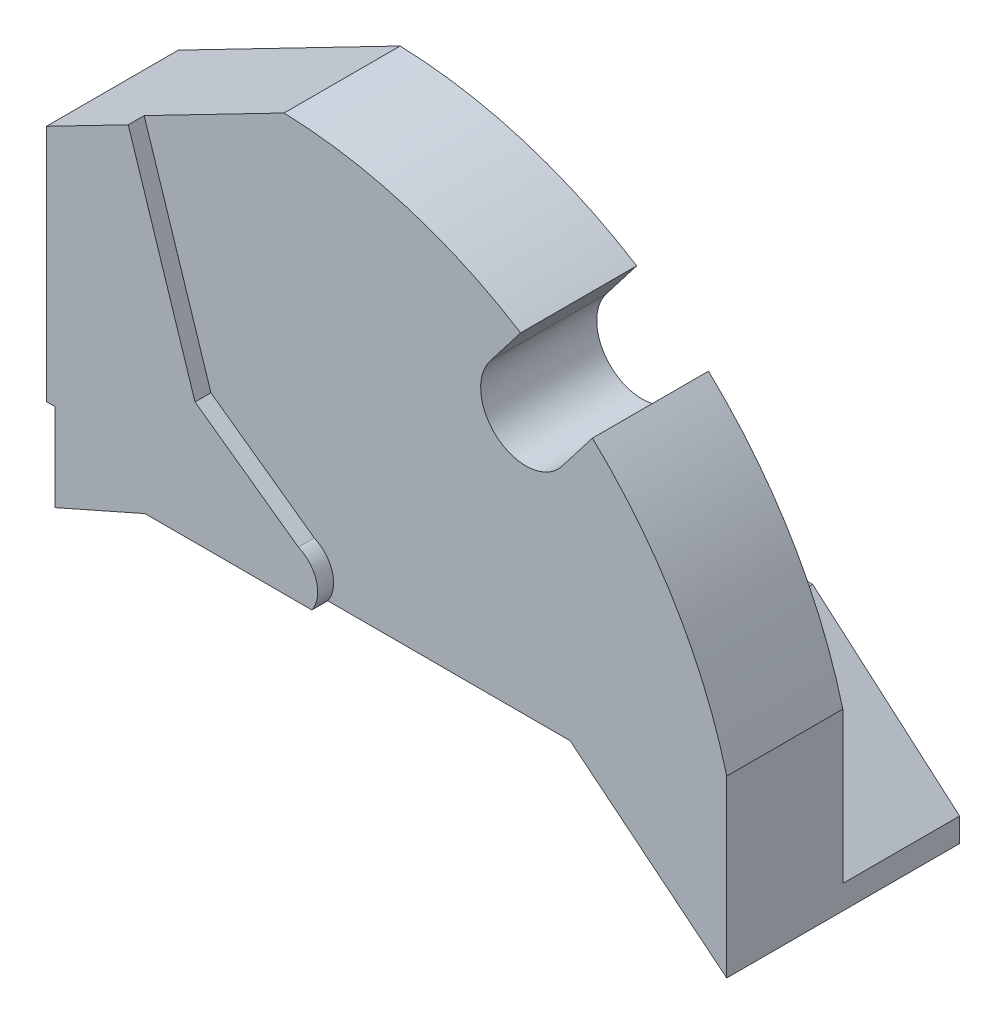
ISO-10303-21;
HEADER;
FILE_DESCRIPTION(('STEP AP214'),'2;1');
FILE_NAME('part.step','',(''),(''),'','','');
FILE_SCHEMA(('AUTOMOTIVE_DESIGN { 1 0 10303 214 1 1 1 1 }'));
ENDSEC;
DATA;
#1=APPLICATION_CONTEXT('core data for automotive mechanical design processes');
#2=APPLICATION_PROTOCOL_DEFINITION('international standard','automotive_design',2000,#1);
#3=PRODUCT_CONTEXT('',#1,'mechanical');
#4=PRODUCT('Part','Part','',(#3));
#5=PRODUCT_RELATED_PRODUCT_CATEGORY('part','',(#4));
#6=PRODUCT_DEFINITION_FORMATION('','',#4);
#7=PRODUCT_DEFINITION_CONTEXT('part definition',#1,'design');
#8=PRODUCT_DEFINITION('design','',#6,#7);
#9=PRODUCT_DEFINITION_SHAPE('','',#8);
#10=(LENGTH_UNIT() NAMED_UNIT(*) SI_UNIT(.MILLI.,.METRE.));
#11=(NAMED_UNIT(*) PLANE_ANGLE_UNIT() SI_UNIT($,.RADIAN.));
#12=(NAMED_UNIT(*) SI_UNIT($,.STERADIAN.) SOLID_ANGLE_UNIT());
#13=UNCERTAINTY_MEASURE_WITH_UNIT(LENGTH_MEASURE(1.E-05),#10,'distance_accuracy_value','');
#14=(GEOMETRIC_REPRESENTATION_CONTEXT(3) GLOBAL_UNCERTAINTY_ASSIGNED_CONTEXT((#13)) GLOBAL_UNIT_ASSIGNED_CONTEXT((#10,
#11,#12)) REPRESENTATION_CONTEXT('',''));
#15=CARTESIAN_POINT('',(0.,0.,0.));
#16=DIRECTION('',(0.,0.,1.));
#17=DIRECTION('',(1.,0.,0.));
#18=AXIS2_PLACEMENT_3D('',#15,#16,#17);
#19=CARTESIAN_POINT('',(0.,0.,0.));
#20=DIRECTION('',(0.,0.,1.));
#21=DIRECTION('',(1.,0.,0.));
#22=AXIS2_PLACEMENT_3D('',#19,#20,#21);
#23=PLANE('',#22);
#24=DIRECTION('',(0.756363172452144,-0.654151932931584,0.));
#25=VECTOR('',#24,1.);
#26=CARTESIAN_POINT('',(65.1,-3.00000000000001,0.));
#27=LINE('',#26,#25);
#28=CARTESIAN_POINT('',(65.1,-3.00000000000001,0.));
#29=VERTEX_POINT('',#28);
#30=CARTESIAN_POINT('',(83.6,-19.,0.));
#31=VERTEX_POINT('',#30);
#32=EDGE_CURVE('E469',#29,#31,#27,.T.);
#33=ORIENTED_EDGE('',*,*,#32,.F.);
#34=DIRECTION('',(1.,0.,0.));
#35=VECTOR('',#34,1.);
#36=CARTESIAN_POINT('',(1.1,-3.,0.));
#37=LINE('',#36,#35);
#38=CARTESIAN_POINT('',(1.1,-3.,0.));
#39=VERTEX_POINT('',#38);
#40=EDGE_CURVE('E538',#39,#29,#37,.T.);
#41=ORIENTED_EDGE('',*,*,#40,.F.);
#42=DIRECTION('',(0.,-1.,0.));
#43=VECTOR('',#42,1.);
#44=CARTESIAN_POINT('',(1.1,0.,0.));
#45=LINE('',#44,#43);
#46=CARTESIAN_POINT('',(1.1,0.,0.));
#47=VERTEX_POINT('',#46);
#48=EDGE_CURVE('E434',#47,#39,#45,.T.);
#49=ORIENTED_EDGE('',*,*,#48,.F.);
#50=DIRECTION('',(1.,0.,0.));
#51=VECTOR('',#50,1.);
#52=CARTESIAN_POINT('',(0.,0.,0.));
#53=LINE('',#52,#51);
#54=CARTESIAN_POINT('',(0.,0.,0.));
#55=VERTEX_POINT('',#54);
#56=EDGE_CURVE('E441',#55,#47,#53,.T.);
#57=ORIENTED_EDGE('',*,*,#56,.F.);
#58=DIRECTION('',(0.,1.,0.));
#59=VECTOR('',#58,1.);
#60=CARTESIAN_POINT('',(0.,0.,0.));
#61=LINE('',#60,#59);
#62=CARTESIAN_POINT('',(0.,30.,0.));
#63=VERTEX_POINT('',#62);
#64=EDGE_CURVE('E216',#55,#63,#61,.T.);
#65=ORIENTED_EDGE('',*,*,#64,.T.);
#66=DIRECTION('',(0.888620657054864,0.458642919770252,0.));
#67=VECTOR('',#66,1.);
#68=CARTESIAN_POINT('',(-12.2267871815941,23.6894001643385,0.));
#69=LINE('',#68,#67);
#70=CARTESIAN_POINT('',(27.9026886315227,44.4013876807859,0.));
#71=VERTEX_POINT('',#70);
#72=EDGE_CURVE('E415',#63,#71,#69,.T.);
#73=ORIENTED_EDGE('',*,*,#72,.T.);
#74=CARTESIAN_POINT('',(26.0383155725036,-15.0714703881564,0.));
#75=DIRECTION('',(0.,0.,1.));
#76=DIRECTION('',(1.,0.,0.));
#77=AXIS2_PLACEMENT_3D('',#74,#75,#76);
#78=CIRCLE('',#77,59.5020733570836);
#79=CARTESIAN_POINT('',(57.6691300930447,35.3268262751127,0.));
#80=VERTEX_POINT('',#79);
#81=EDGE_CURVE('E409',#71,#80,#78,.F.);
#82=ORIENTED_EDGE('',*,*,#81,.T.);
#83=DIRECTION('',(-0.610285473289121,-0.792181570785558,0.));
#84=VECTOR('',#83,1.);
#85=CARTESIAN_POINT('',(19.1113591408394,-14.7231206690401,0.));
#86=LINE('',#85,#84);
#87=CARTESIAN_POINT('',(53.8243316113232,30.3360823791637,0.));
#88=VERTEX_POINT('',#87);
#89=EDGE_CURVE('E401',#80,#88,#86,.T.);
#90=ORIENTED_EDGE('',*,*,#89,.T.);
#91=CARTESIAN_POINT('',(58.3397665648009,26.8574551814157,0.));
#92=DIRECTION('',(0.,0.,1.));
#93=DIRECTION('',(1.,0.,0.));
#94=AXIS2_PLACEMENT_3D('',#91,#92,#93);
#95=CIRCLE('',#94,5.69999999999999);
#96=CARTESIAN_POINT('',(62.8552015182785,23.3788279836677,0.));
#97=VERTEX_POINT('',#96);
#98=EDGE_CURVE('E410',#88,#97,#95,.T.);
#99=ORIENTED_EDGE('',*,*,#98,.T.);
#100=DIRECTION('',(-0.610285473289121,-0.792181570785558,0.));
#101=VECTOR('',#100,1.);
#102=CARTESIAN_POINT('',(28.1422290477947,-21.6803750645361,0.));
#103=LINE('',#102,#101);
#104=CARTESIAN_POINT('',(66.7,28.3695718796167,0.));
#105=VERTEX_POINT('',#104);
#106=EDGE_CURVE('E424',#105,#97,#103,.T.);
#107=ORIENTED_EDGE('',*,*,#106,.F.);
#108=CARTESIAN_POINT('',(83.6,0.,0.));
#109=VERTEX_POINT('',#108);
#110=EDGE_CURVE('E419',#105,#109,#78,.F.);
#111=ORIENTED_EDGE('',*,*,#110,.T.);
#112=DIRECTION('',(0.,1.,0.));
#113=VECTOR('',#112,1.);
#114=CARTESIAN_POINT('',(83.6,0.,0.));
#115=LINE('',#114,#113);
#116=EDGE_CURVE('E425',#31,#109,#115,.T.);
#117=ORIENTED_EDGE('',*,*,#116,.F.);
#118=EDGE_LOOP('',(#33,#41,#49,#57,#65,#73,#82,#90,#99,#107,#111,#117));
#119=FACE_BOUND('',#118,.T.);
#120=ADVANCED_FACE('F47',(#119),#23,.F.);
#121=CARTESIAN_POINT('',(0.,-6.,14.6));
#122=DIRECTION('',(0.,1.,0.));
#123=DIRECTION('',(0.,0.,1.));
#124=AXIS2_PLACEMENT_3D('',#121,#122,#123);
#125=PLANE('',#124);
#126=DIRECTION('',(-1.,0.,0.));
#127=VECTOR('',#126,1.);
#128=CARTESIAN_POINT('',(1.1,-6.,-11.6));
#129=LINE('',#128,#127);
#130=CARTESIAN_POINT('',(62.8102178134441,-6.,-11.6));
#131=VERTEX_POINT('',#130);
#132=CARTESIAN_POINT('',(33.8,-6.,-11.6));
#133=VERTEX_POINT('',#132);
#134=EDGE_CURVE('E581',#131,#133,#129,.T.);
#135=ORIENTED_EDGE('',*,*,#134,.F.);
#136=DIRECTION('',(0.0412222680022954,0.,0.999150001061275));
#137=VECTOR('',#136,1.);
#138=CARTESIAN_POINT('',(62.6823200696906,-6.,-14.7));
#139=LINE('',#138,#137);
#140=CARTESIAN_POINT('',(63.8911600348453,-6.,14.6));
#141=VERTEX_POINT('',#140);
#142=EDGE_CURVE('E285',#131,#141,#139,.T.);
#143=ORIENTED_EDGE('',*,*,#142,.T.);
#144=DIRECTION('',(1.,0.,0.));
#145=VECTOR('',#144,1.);
#146=CARTESIAN_POINT('',(0.,-6.,14.6));
#147=LINE('',#146,#145);
#148=CARTESIAN_POINT('',(33.4,-6.,14.6));
#149=VERTEX_POINT('',#148);
#150=EDGE_CURVE('E51',#149,#141,#147,.T.);
#151=ORIENTED_EDGE('',*,*,#150,.F.);
#152=DIRECTION('',(0.,0.,-1.));
#153=VECTOR('',#152,1.);
#154=CARTESIAN_POINT('',(33.4,-6.,16.6));
#155=LINE('',#154,#153);
#156=CARTESIAN_POINT('',(33.4,-6.,16.6));
#157=VERTEX_POINT('',#156);
#158=EDGE_CURVE('E281',#157,#149,#155,.T.);
#159=ORIENTED_EDGE('',*,*,#158,.F.);
#160=DIRECTION('',(1.,0.,0.));
#161=VECTOR('',#160,1.);
#162=CARTESIAN_POINT('',(12.4,-6.,16.6));
#163=LINE('',#162,#161);
#164=CARTESIAN_POINT('',(12.4,-6.,16.6));
#165=VERTEX_POINT('',#164);
#166=EDGE_CURVE('E249',#165,#157,#163,.T.);
#167=ORIENTED_EDGE('',*,*,#166,.F.);
#168=DIRECTION('',(0.,0.,1.));
#169=VECTOR('',#168,1.);
#170=CARTESIAN_POINT('',(12.4,-6.,3.3));
#171=LINE('',#170,#169);
#172=CARTESIAN_POINT('',(12.4,-6.,3.3));
#173=VERTEX_POINT('',#172);
#174=EDGE_CURVE('E543',#173,#165,#171,.T.);
#175=ORIENTED_EDGE('',*,*,#174,.F.);
#176=DIRECTION('',(1.,0.,0.));
#177=VECTOR('',#176,1.);
#178=CARTESIAN_POINT('',(1.1,-6.,3.3));
#179=LINE('',#178,#177);
#180=CARTESIAN_POINT('',(33.8,-6.,3.3));
#181=VERTEX_POINT('',#180);
#182=EDGE_CURVE('E570',#173,#181,#179,.T.);
#183=ORIENTED_EDGE('',*,*,#182,.T.);
#184=DIRECTION('',(0.,0.,1.));
#185=VECTOR('',#184,1.);
#186=CARTESIAN_POINT('',(33.8,-6.,-11.6));
#187=LINE('',#186,#185);
#188=EDGE_CURVE('E559',#133,#181,#187,.T.);
#189=ORIENTED_EDGE('',*,*,#188,.F.);
#190=EDGE_LOOP('',(#135,#143,#151,#159,#167,#175,#183,#189));
#191=FACE_BOUND('',#190,.T.);
#192=ADVANCED_FACE('F352',(#191),#125,.F.);
#193=CARTESIAN_POINT('',(58.3397665648009,26.8574551814157,14.6));
#194=DIRECTION('',(0.,0.,-1.));
#195=DIRECTION('',(-1.,0.,0.));
#196=AXIS2_PLACEMENT_3D('',#193,#194,#195);
#197=CYLINDRICAL_SURFACE('',#196,5.69999999999999);
#198=ORIENTED_EDGE('',*,*,#98,.F.);
#199=DIRECTION('',(0.,0.,-1.));
#200=VECTOR('',#199,1.);
#201=CARTESIAN_POINT('',(53.8243316113232,30.3360823791637,14.6));
#202=LINE('',#201,#200);
#203=CARTESIAN_POINT('',(53.8243316113232,30.3360823791637,14.6));
#204=VERTEX_POINT('',#203);
#205=EDGE_CURVE('E58',#204,#88,#202,.T.);
#206=ORIENTED_EDGE('',*,*,#205,.F.);
#207=CARTESIAN_POINT('',(58.3397665648009,26.8574551814157,14.6));
#208=DIRECTION('',(0.,0.,1.));
#209=DIRECTION('',(1.,0.,0.));
#210=AXIS2_PLACEMENT_3D('',#207,#208,#209);
#211=CIRCLE('',#210,5.69999999999999);
#212=CARTESIAN_POINT('',(62.8552015182785,23.3788279836677,14.6));
#213=VERTEX_POINT('',#212);
#214=EDGE_CURVE('E432',#204,#213,#211,.T.);
#215=ORIENTED_EDGE('',*,*,#214,.T.);
#216=DIRECTION('',(0.,0.,-1.));
#217=VECTOR('',#216,1.);
#218=CARTESIAN_POINT('',(62.8552015182785,23.3788279836677,14.6));
#219=LINE('',#218,#217);
#220=EDGE_CURVE('E445',#213,#97,#219,.T.);
#221=ORIENTED_EDGE('',*,*,#220,.T.);
#222=EDGE_LOOP('',(#198,#206,#215,#221));
#223=FACE_BOUND('',#222,.T.);
#224=ADVANCED_FACE('F49',(#223),#197,.F.);
#225=CARTESIAN_POINT('',(19.1113591408394,-14.7231206690401,14.6));
#226=DIRECTION('',(0.792181570785558,-0.610285473289121,0.));
#227=DIRECTION('',(0.610285473289121,0.792181570785558,0.));
#228=AXIS2_PLACEMENT_3D('',#225,#226,#227);
#229=PLANE('',#228);
#230=ORIENTED_EDGE('',*,*,#89,.F.);
#231=DIRECTION('',(0.,0.,-1.));
#232=VECTOR('',#231,1.);
#233=CARTESIAN_POINT('',(57.6691300930447,35.3268262751127,14.6));
#234=LINE('',#233,#232);
#235=CARTESIAN_POINT('',(57.6691300930447,35.3268262751127,14.6));
#236=VERTEX_POINT('',#235);
#237=EDGE_CURVE('E404',#236,#80,#234,.T.);
#238=ORIENTED_EDGE('',*,*,#237,.F.);
#239=DIRECTION('',(-0.610285473289121,-0.792181570785558,0.));
#240=VECTOR('',#239,1.);
#241=CARTESIAN_POINT('',(19.1113591408394,-14.7231206690401,14.6));
#242=LINE('',#241,#240);
#243=EDGE_CURVE('E523',#236,#204,#242,.T.);
#244=ORIENTED_EDGE('',*,*,#243,.T.);
#245=ORIENTED_EDGE('',*,*,#205,.T.);
#246=EDGE_LOOP('',(#230,#238,#244,#245));
#247=FACE_BOUND('',#246,.T.);
#248=ADVANCED_FACE('F390',(#247),#229,.T.);
#249=CARTESIAN_POINT('',(26.0383155725036,-15.0714703881564,14.6));
#250=DIRECTION('',(0.,0.,-1.));
#251=DIRECTION('',(-1.,0.,0.));
#252=AXIS2_PLACEMENT_3D('',#249,#250,#251);
#253=CYLINDRICAL_SURFACE('',#252,59.5020733570836);
#254=ORIENTED_EDGE('',*,*,#81,.F.);
#255=DIRECTION('',(0.,0.,-1.));
#256=VECTOR('',#255,1.);
#257=CARTESIAN_POINT('',(27.9026886315227,44.4013876807859,14.6));
#258=LINE('',#257,#256);
#259=CARTESIAN_POINT('',(27.9026886315227,44.4013876807859,14.6));
#260=VERTEX_POINT('',#259);
#261=EDGE_CURVE('E459',#260,#71,#258,.T.);
#262=ORIENTED_EDGE('',*,*,#261,.F.);
#263=CARTESIAN_POINT('',(26.0383155725036,-15.0714703881564,14.6));
#264=DIRECTION('',(0.,0.,1.));
#265=DIRECTION('',(1.,0.,0.));
#266=AXIS2_PLACEMENT_3D('',#263,#264,#265);
#267=CIRCLE('',#266,59.5020733570836);
#268=EDGE_CURVE('E516',#260,#236,#267,.F.);
#269=ORIENTED_EDGE('',*,*,#268,.T.);
#270=ORIENTED_EDGE('',*,*,#237,.T.);
#271=EDGE_LOOP('',(#254,#262,#269,#270));
#272=FACE_BOUND('',#271,.T.);
#273=ADVANCED_FACE('F375',(#272),#253,.T.);
#274=CARTESIAN_POINT('',(-12.2267871815941,23.6894001643385,14.6));
#275=DIRECTION('',(-0.458642919770252,0.888620657054864,0.));
#276=DIRECTION('',(-0.888620657054864,-0.458642919770252,0.));
#277=AXIS2_PLACEMENT_3D('',#274,#275,#276);
#278=PLANE('',#277);
#279=ORIENTED_EDGE('',*,*,#72,.F.);
#280=DIRECTION('',(0.,0.,-1.));
#281=VECTOR('',#280,1.);
#282=CARTESIAN_POINT('',(0.,30.,14.6));
#283=LINE('',#282,#281);
#284=CARTESIAN_POINT('',(0.,30.,16.6));
#285=VERTEX_POINT('',#284);
#286=EDGE_CURVE('E220',#285,#63,#283,.T.);
#287=ORIENTED_EDGE('',*,*,#286,.F.);
#288=DIRECTION('',(-0.888620657054864,-0.458642919770253,0.));
#289=VECTOR('',#288,1.);
#290=CARTESIAN_POINT('',(0.,30.,16.6));
#291=LINE('',#290,#289);
#292=CARTESIAN_POINT('',(10.3,35.3161290322581,16.6));
#293=VERTEX_POINT('',#292);
#294=EDGE_CURVE('E236',#293,#285,#291,.T.);
#295=ORIENTED_EDGE('',*,*,#294,.F.);
#296=DIRECTION('',(0.,0.,-1.));
#297=VECTOR('',#296,1.);
#298=CARTESIAN_POINT('',(10.3,35.3161290322581,16.6));
#299=LINE('',#298,#297);
#300=CARTESIAN_POINT('',(10.3,35.3161290322581,14.6));
#301=VERTEX_POINT('',#300);
#302=EDGE_CURVE('E263',#293,#301,#299,.T.);
#303=ORIENTED_EDGE('',*,*,#302,.T.);
#304=DIRECTION('',(0.888620657054864,0.458642919770252,0.));
#305=VECTOR('',#304,1.);
#306=CARTESIAN_POINT('',(-12.2267871815941,23.6894001643385,14.6));
#307=LINE('',#306,#305);
#308=EDGE_CURVE('E71',#301,#260,#307,.T.);
#309=ORIENTED_EDGE('',*,*,#308,.T.);
#310=ORIENTED_EDGE('',*,*,#261,.T.);
#311=EDGE_LOOP('',(#279,#287,#295,#303,#309,#310));
#312=FACE_BOUND('',#311,.T.);
#313=ADVANCED_FACE('F387',(#312),#278,.T.);
#314=CARTESIAN_POINT('',(0.,0.,14.6));
#315=DIRECTION('',(-1.,0.,0.));
#316=DIRECTION('',(0.,0.,1.));
#317=AXIS2_PLACEMENT_3D('',#314,#315,#316);
#318=PLANE('',#317);
#319=ORIENTED_EDGE('',*,*,#64,.F.);
#320=DIRECTION('',(0.,0.,-1.));
#321=VECTOR('',#320,1.);
#322=CARTESIAN_POINT('',(0.,0.,14.6));
#323=LINE('',#322,#321);
#324=CARTESIAN_POINT('',(0.,0.,16.6));
#325=VERTEX_POINT('',#324);
#326=EDGE_CURVE('E210',#325,#55,#323,.T.);
#327=ORIENTED_EDGE('',*,*,#326,.F.);
#328=DIRECTION('',(0.,-1.,0.));
#329=VECTOR('',#328,1.);
#330=CARTESIAN_POINT('',(0.,30.,16.6));
#331=LINE('',#330,#329);
#332=EDGE_CURVE('E214',#285,#325,#331,.T.);
#333=ORIENTED_EDGE('',*,*,#332,.F.);
#334=ORIENTED_EDGE('',*,*,#286,.T.);
#335=EDGE_LOOP('',(#319,#327,#333,#334));
#336=FACE_BOUND('',#335,.T.);
#337=ADVANCED_FACE('F212',(#336),#318,.T.);
#338=CARTESIAN_POINT('',(0.,0.,14.6));
#339=DIRECTION('',(0.,1.,0.));
#340=DIRECTION('',(0.,0.,1.));
#341=AXIS2_PLACEMENT_3D('',#338,#339,#340);
#342=PLANE('',#341);
#343=ORIENTED_EDGE('',*,*,#56,.T.);
#344=DIRECTION('',(0.,0.,-1.));
#345=VECTOR('',#344,1.);
#346=CARTESIAN_POINT('',(1.1,0.,14.6));
#347=LINE('',#346,#345);
#348=CARTESIAN_POINT('',(1.1,0.,16.6));
#349=VERTEX_POINT('',#348);
#350=EDGE_CURVE('E221',#349,#47,#347,.T.);
#351=ORIENTED_EDGE('',*,*,#350,.F.);
#352=DIRECTION('',(1.,0.,0.));
#353=VECTOR('',#352,1.);
#354=CARTESIAN_POINT('',(0.,0.,16.6));
#355=LINE('',#354,#353);
#356=EDGE_CURVE('E224',#325,#349,#355,.T.);
#357=ORIENTED_EDGE('',*,*,#356,.F.);
#358=ORIENTED_EDGE('',*,*,#326,.T.);
#359=EDGE_LOOP('',(#343,#351,#357,#358));
#360=FACE_BOUND('',#359,.T.);
#361=ADVANCED_FACE('F225',(#360),#342,.F.);
#362=CARTESIAN_POINT('',(1.1,0.,14.6));
#363=DIRECTION('',(1.,0.,0.));
#364=DIRECTION('',(0.,1.,0.));
#365=AXIS2_PLACEMENT_3D('',#362,#363,#364);
#366=PLANE('',#365);
#367=DIRECTION('',(0.,1.,0.));
#368=VECTOR('',#367,1.);
#369=CARTESIAN_POINT('',(1.1,-6.,-14.7));
#370=LINE('',#369,#368);
#371=CARTESIAN_POINT('',(1.1,-22.05,-14.7));
#372=VERTEX_POINT('',#371);
#373=CARTESIAN_POINT('',(1.1,-3.,-14.7));
#374=VERTEX_POINT('',#373);
#375=EDGE_CURVE('E542',#372,#374,#370,.T.);
#376=ORIENTED_EDGE('',*,*,#375,.F.);
#377=DIRECTION('',(0.,-0.701334767459583,-0.712832058729412));
#378=VECTOR('',#377,1.);
#379=CARTESIAN_POINT('',(1.1,-22.05,-14.7));
#380=LINE('',#379,#378);
#381=CARTESIAN_POINT('',(1.1,-19.,-11.6));
#382=VERTEX_POINT('',#381);
#383=EDGE_CURVE('E490',#382,#372,#380,.T.);
#384=ORIENTED_EDGE('',*,*,#383,.F.);
#385=DIRECTION('',(0.,0.,1.));
#386=VECTOR('',#385,1.);
#387=CARTESIAN_POINT('',(1.1,-19.,-11.6));
#388=LINE('',#387,#386);
#389=CARTESIAN_POINT('',(1.1,-19.,3.3));
#390=VERTEX_POINT('',#389);
#391=EDGE_CURVE('E562',#382,#390,#388,.T.);
#392=ORIENTED_EDGE('',*,*,#391,.T.);
#393=DIRECTION('',(0.,1.,0.));
#394=VECTOR('',#393,1.);
#395=CARTESIAN_POINT('',(1.1,-19.,3.3));
#396=LINE('',#395,#394);
#397=CARTESIAN_POINT('',(1.1,-11.,3.3));
#398=VERTEX_POINT('',#397);
#399=EDGE_CURVE('E574',#390,#398,#396,.T.);
#400=ORIENTED_EDGE('',*,*,#399,.T.);
#401=DIRECTION('',(0.,0.,1.));
#402=VECTOR('',#401,1.);
#403=CARTESIAN_POINT('',(1.1,-11.,3.3));
#404=LINE('',#403,#402);
#405=CARTESIAN_POINT('',(1.1,-11.,16.6));
#406=VERTEX_POINT('',#405);
#407=EDGE_CURVE('E550',#398,#406,#404,.T.);
#408=ORIENTED_EDGE('',*,*,#407,.T.);
#409=DIRECTION('',(0.,-1.,0.));
#410=VECTOR('',#409,1.);
#411=CARTESIAN_POINT('',(1.1,0.,16.6));
#412=LINE('',#411,#410);
#413=EDGE_CURVE('E231',#349,#406,#412,.T.);
#414=ORIENTED_EDGE('',*,*,#413,.F.);
#415=ORIENTED_EDGE('',*,*,#350,.T.);
#416=ORIENTED_EDGE('',*,*,#48,.T.);
#417=DIRECTION('',(0.,0.,1.));
#418=VECTOR('',#417,1.);
#419=CARTESIAN_POINT('',(1.1,-3.,-14.7));
#420=LINE('',#419,#418);
#421=EDGE_CURVE('E530',#374,#39,#420,.T.);
#422=ORIENTED_EDGE('',*,*,#421,.F.);
#423=EDGE_LOOP('',(#376,#384,#392,#400,#408,#414,#415,#416,#422));
#424=FACE_BOUND('',#423,.T.);
#425=ADVANCED_FACE('F377',(#424),#366,.F.);
#426=CARTESIAN_POINT('',(83.6,0.,14.6));
#427=DIRECTION('',(-1.,0.,0.));
#428=DIRECTION('',(0.,0.,1.));
#429=AXIS2_PLACEMENT_3D('',#426,#427,#428);
#430=PLANE('',#429);
#431=DIRECTION('',(0.,0.,-1.));
#432=VECTOR('',#431,1.);
#433=CARTESIAN_POINT('',(83.6,-22.,14.6));
#434=LINE('',#433,#432);
#435=CARTESIAN_POINT('',(83.6,-22.,14.6));
#436=VERTEX_POINT('',#435);
#437=CARTESIAN_POINT('',(83.6,-22.,-14.6491803278688));
#438=VERTEX_POINT('',#437);
#439=EDGE_CURVE('E486',#436,#438,#434,.T.);
#440=ORIENTED_EDGE('',*,*,#439,.T.);
#441=DIRECTION('',(0.,0.,-1.));
#442=VECTOR('',#441,1.);
#443=CARTESIAN_POINT('',(83.6,-22.,-11.6));
#444=LINE('',#443,#442);
#445=CARTESIAN_POINT('',(83.6,-22.,-14.7));
#446=VERTEX_POINT('',#445);
#447=EDGE_CURVE('E466',#438,#446,#444,.T.);
#448=ORIENTED_EDGE('',*,*,#447,.T.);
#449=DIRECTION('',(0.,-1.,0.));
#450=VECTOR('',#449,1.);
#451=CARTESIAN_POINT('',(83.6,-19.,-14.7));
#452=LINE('',#451,#450);
#453=CARTESIAN_POINT('',(83.6,-19.,-14.7));
#454=VERTEX_POINT('',#453);
#455=EDGE_CURVE('E478',#454,#446,#452,.T.);
#456=ORIENTED_EDGE('',*,*,#455,.F.);
#457=DIRECTION('',(0.,0.,1.));
#458=VECTOR('',#457,1.);
#459=CARTESIAN_POINT('',(83.6,-19.,-14.7));
#460=LINE('',#459,#458);
#461=EDGE_CURVE('E482',#454,#31,#460,.T.);
#462=ORIENTED_EDGE('',*,*,#461,.T.);
#463=ORIENTED_EDGE('',*,*,#116,.T.);
#464=DIRECTION('',(0.,0.,-1.));
#465=VECTOR('',#464,1.);
#466=CARTESIAN_POINT('',(83.6,0.,14.6));
#467=LINE('',#466,#465);
#468=CARTESIAN_POINT('',(83.6,0.,14.6));
#469=VERTEX_POINT('',#468);
#470=EDGE_CURVE('E452',#469,#109,#467,.T.);
#471=ORIENTED_EDGE('',*,*,#470,.F.);
#472=DIRECTION('',(0.,1.,0.));
#473=VECTOR('',#472,1.);
#474=CARTESIAN_POINT('',(83.6,0.,14.6));
#475=LINE('',#474,#473);
#476=EDGE_CURVE('E493',#436,#469,#475,.T.);
#477=ORIENTED_EDGE('',*,*,#476,.F.);
#478=EDGE_LOOP('',(#440,#448,#456,#462,#463,#471,#477));
#479=FACE_BOUND('',#478,.T.);
#480=ADVANCED_FACE('F373',(#479),#430,.F.);
#481=ORIENTED_EDGE('',*,*,#110,.F.);
#482=DIRECTION('',(0.,0.,-1.));
#483=VECTOR('',#482,1.);
#484=CARTESIAN_POINT('',(66.7,28.3695718796167,14.6));
#485=LINE('',#484,#483);
#486=CARTESIAN_POINT('',(66.7,28.3695718796167,14.6));
#487=VERTEX_POINT('',#486);
#488=EDGE_CURVE('E448',#487,#105,#485,.T.);
#489=ORIENTED_EDGE('',*,*,#488,.F.);
#490=EDGE_CURVE('E496',#487,#469,#267,.F.);
#491=ORIENTED_EDGE('',*,*,#490,.T.);
#492=ORIENTED_EDGE('',*,*,#470,.T.);
#493=EDGE_LOOP('',(#481,#489,#491,#492));
#494=FACE_BOUND('',#493,.T.);
#495=ADVANCED_FACE('F369',(#494),#253,.T.);
#496=CARTESIAN_POINT('',(28.1422290477947,-21.6803750645361,14.6));
#497=DIRECTION('',(0.792181570785558,-0.610285473289121,0.));
#498=DIRECTION('',(0.610285473289121,0.792181570785558,0.));
#499=AXIS2_PLACEMENT_3D('',#496,#497,#498);
#500=PLANE('',#499);
#501=ORIENTED_EDGE('',*,*,#106,.T.);
#502=ORIENTED_EDGE('',*,*,#220,.F.);
#503=DIRECTION('',(-0.610285473289121,-0.792181570785558,0.));
#504=VECTOR('',#503,1.);
#505=CARTESIAN_POINT('',(28.1422290477947,-21.6803750645361,14.6));
#506=LINE('',#505,#504);
#507=EDGE_CURVE('E449',#487,#213,#506,.T.);
#508=ORIENTED_EDGE('',*,*,#507,.F.);
#509=ORIENTED_EDGE('',*,*,#488,.T.);
#510=EDGE_LOOP('',(#501,#502,#508,#509));
#511=FACE_BOUND('',#510,.T.);
#512=ADVANCED_FACE('F366',(#511),#500,.F.);
#513=CARTESIAN_POINT('',(0.,0.,14.6));
#514=DIRECTION('',(0.,0.,1.));
#515=DIRECTION('',(1.,0.,0.));
#516=AXIS2_PLACEMENT_3D('',#513,#514,#515);
#517=PLANE('',#516);
#518=DIRECTION('',(-0.307430483083326,0.95157054287696,0.));
#519=VECTOR('',#518,1.);
#520=CARTESIAN_POINT('',(10.3,35.3161290322581,14.6));
#521=LINE('',#520,#519);
#522=CARTESIAN_POINT('',(18.7,9.31612903225807,14.6));
#523=VERTEX_POINT('',#522);
#524=EDGE_CURVE('E66',#523,#301,#521,.T.);
#525=ORIENTED_EDGE('',*,*,#524,.F.);
#526=DIRECTION('',(-0.812833043784419,0.58249673212144,0.));
#527=VECTOR('',#526,1.);
#528=CARTESIAN_POINT('',(18.7,9.31612903225807,14.6));
#529=LINE('',#528,#527);
#530=CARTESIAN_POINT('',(31.7,0.,14.6));
#531=VERTEX_POINT('',#530);
#532=EDGE_CURVE('E240',#531,#523,#529,.T.);
#533=ORIENTED_EDGE('',*,*,#532,.F.);
#534=CARTESIAN_POINT('',(30.1393972953127,-3.6830040996614,14.6));
#535=DIRECTION('',(0.,0.,1.));
#536=DIRECTION('',(-1.,0.,0.));
#537=AXIS2_PLACEMENT_3D('',#534,#535,#536);
#538=CIRCLE('',#537,4.);
#539=EDGE_CURVE('E264',#149,#531,#538,.T.);
#540=ORIENTED_EDGE('',*,*,#539,.F.);
#541=ORIENTED_EDGE('',*,*,#150,.T.);
#542=DIRECTION('',(0.77637289881904,-0.630273846815272,0.));
#543=VECTOR('',#542,1.);
#544=CARTESIAN_POINT('',(83.6,-22.,14.6));
#545=LINE('',#544,#543);
#546=EDGE_CURVE('E295',#141,#436,#545,.T.);
#547=ORIENTED_EDGE('',*,*,#546,.T.);
#548=ORIENTED_EDGE('',*,*,#476,.T.);
#549=ORIENTED_EDGE('',*,*,#490,.F.);
#550=ORIENTED_EDGE('',*,*,#507,.T.);
#551=ORIENTED_EDGE('',*,*,#214,.F.);
#552=ORIENTED_EDGE('',*,*,#243,.F.);
#553=ORIENTED_EDGE('',*,*,#268,.F.);
#554=ORIENTED_EDGE('',*,*,#308,.F.);
#555=EDGE_LOOP('',(#525,#533,#540,#541,#547,#548,#549,#550,#551,#552,#553,#554));
#556=FACE_BOUND('',#555,.T.);
#557=ADVANCED_FACE('F363',(#556),#517,.T.);
#558=CARTESIAN_POINT('',(1.1,-3.,-14.7));
#559=DIRECTION('',(0.,-1.,0.));
#560=DIRECTION('',(1.,0.,0.));
#561=AXIS2_PLACEMENT_3D('',#558,#559,#560);
#562=PLANE('',#561);
#563=ORIENTED_EDGE('',*,*,#40,.T.);
#564=DIRECTION('',(0.,0.,1.));
#565=VECTOR('',#564,1.);
#566=CARTESIAN_POINT('',(65.1,-3.00000000000001,-14.7));
#567=LINE('',#566,#565);
#568=CARTESIAN_POINT('',(65.1,-3.00000000000001,-14.7));
#569=VERTEX_POINT('',#568);
#570=EDGE_CURVE('E534',#569,#29,#567,.T.);
#571=ORIENTED_EDGE('',*,*,#570,.F.);
#572=DIRECTION('',(1.,0.,0.));
#573=VECTOR('',#572,1.);
#574=CARTESIAN_POINT('',(1.1,-3.,-14.7));
#575=LINE('',#574,#573);
#576=EDGE_CURVE('E537',#374,#569,#575,.T.);
#577=ORIENTED_EDGE('',*,*,#576,.F.);
#578=ORIENTED_EDGE('',*,*,#421,.T.);
#579=EDGE_LOOP('',(#563,#571,#577,#578));
#580=FACE_BOUND('',#579,.T.);
#581=ADVANCED_FACE('F613',(#580),#562,.F.);
#582=CARTESIAN_POINT('',(0.,0.,-14.7));
#583=DIRECTION('',(0.,0.,-1.));
#584=DIRECTION('',(-1.,0.,0.));
#585=AXIS2_PLACEMENT_3D('',#582,#583,#584);
#586=PLANE('',#585);
#587=ORIENTED_EDGE('',*,*,#455,.T.);
#588=DIRECTION('',(-0.999996347719059,-0.00270269283167321,0.));
#589=VECTOR('',#588,1.);
#590=CARTESIAN_POINT('',(65.1,-22.05,-14.7));
#591=LINE('',#590,#589);
#592=CARTESIAN_POINT('',(65.1,-22.05,-14.7));
#593=VERTEX_POINT('',#592);
#594=EDGE_CURVE('E470',#446,#593,#591,.T.);
#595=ORIENTED_EDGE('',*,*,#594,.T.);
#596=DIRECTION('',(1.,0.,0.));
#597=VECTOR('',#596,1.);
#598=CARTESIAN_POINT('',(1.1,-22.05,-14.7));
#599=LINE('',#598,#597);
#600=EDGE_CURVE('E584',#372,#593,#599,.T.);
#601=ORIENTED_EDGE('',*,*,#600,.F.);
#602=ORIENTED_EDGE('',*,*,#375,.T.);
#603=ORIENTED_EDGE('',*,*,#576,.T.);
#604=DIRECTION('',(0.756363172452144,-0.654151932931584,0.));
#605=VECTOR('',#604,1.);
#606=CARTESIAN_POINT('',(65.1,-3.00000000000001,-14.7));
#607=LINE('',#606,#605);
#608=EDGE_CURVE('E483',#569,#454,#607,.T.);
#609=ORIENTED_EDGE('',*,*,#608,.T.);
#610=EDGE_LOOP('',(#587,#595,#601,#602,#603,#609));
#611=FACE_BOUND('',#610,.T.);
#612=ADVANCED_FACE('F599',(#611),#586,.T.);
#613=CARTESIAN_POINT('',(12.4,-6.,3.3));
#614=DIRECTION('',(0.404636175116748,-0.91447775576385,0.));
#615=DIRECTION('',(0.914477755763851,0.404636175116748,0.));
#616=AXIS2_PLACEMENT_3D('',#613,#614,#615);
#617=PLANE('',#616);
#618=ORIENTED_EDGE('',*,*,#174,.T.);
#619=DIRECTION('',(0.91447775576385,0.404636175116748,0.));
#620=VECTOR('',#619,1.);
#621=CARTESIAN_POINT('',(1.1,-11.,16.6));
#622=LINE('',#621,#620);
#623=EDGE_CURVE('E245',#406,#165,#622,.T.);
#624=ORIENTED_EDGE('',*,*,#623,.F.);
#625=ORIENTED_EDGE('',*,*,#407,.F.);
#626=DIRECTION('',(0.91447775576385,0.404636175116748,0.));
#627=VECTOR('',#626,1.);
#628=CARTESIAN_POINT('',(12.4,-6.,3.3));
#629=LINE('',#628,#627);
#630=EDGE_CURVE('E553',#398,#173,#629,.T.);
#631=ORIENTED_EDGE('',*,*,#630,.T.);
#632=EDGE_LOOP('',(#618,#624,#625,#631));
#633=FACE_BOUND('',#632,.T.);
#634=ADVANCED_FACE('F621',(#633),#617,.T.);
#635=CARTESIAN_POINT('',(33.8,-6.,-11.6));
#636=DIRECTION('',(-0.369430008089838,0.929258558810594,0.));
#637=DIRECTION('',(-0.929258558810594,-0.369430008089838,0.));
#638=AXIS2_PLACEMENT_3D('',#635,#636,#637);
#639=PLANE('',#638);
#640=DIRECTION('',(-0.929258558810594,-0.369430008089838,0.));
#641=VECTOR('',#640,1.);
#642=CARTESIAN_POINT('',(33.8,-6.,3.3));
#643=LINE('',#642,#641);
#644=EDGE_CURVE('E567',#181,#390,#643,.T.);
#645=ORIENTED_EDGE('',*,*,#644,.T.);
#646=ORIENTED_EDGE('',*,*,#391,.F.);
#647=DIRECTION('',(-0.929258558810594,-0.369430008089838,0.));
#648=VECTOR('',#647,1.);
#649=CARTESIAN_POINT('',(33.8,-6.,-11.6));
#650=LINE('',#649,#648);
#651=EDGE_CURVE('E566',#133,#382,#650,.T.);
#652=ORIENTED_EDGE('',*,*,#651,.F.);
#653=ORIENTED_EDGE('',*,*,#188,.T.);
#654=EDGE_LOOP('',(#645,#646,#652,#653));
#655=FACE_BOUND('',#654,.T.);
#656=ADVANCED_FACE('F725',(#655),#639,.F.);
#657=CARTESIAN_POINT('',(0.,0.,3.3));
#658=DIRECTION('',(0.,0.,-1.));
#659=DIRECTION('',(-1.,0.,0.));
#660=AXIS2_PLACEMENT_3D('',#657,#658,#659);
#661=PLANE('',#660);
#662=ORIENTED_EDGE('',*,*,#630,.F.);
#663=ORIENTED_EDGE('',*,*,#399,.F.);
#664=ORIENTED_EDGE('',*,*,#644,.F.);
#665=ORIENTED_EDGE('',*,*,#182,.F.);
#666=EDGE_LOOP('',(#662,#663,#664,#665));
#667=FACE_BOUND('',#666,.T.);
#668=ADVANCED_FACE('F682',(#667),#661,.F.);
#669=CARTESIAN_POINT('',(1.1,-19.,-11.6));
#670=DIRECTION('',(0.,0.,-1.));
#671=DIRECTION('',(-1.,0.,0.));
#672=AXIS2_PLACEMENT_3D('',#669,#670,#671);
#673=PLANE('',#672);
#674=DIRECTION('',(-1.,0.,0.));
#675=VECTOR('',#674,1.);
#676=CARTESIAN_POINT('',(1.1,-19.,-11.6));
#677=LINE('',#676,#675);
#678=CARTESIAN_POINT('',(79.7019158400208,-19.,-11.6));
#679=VERTEX_POINT('',#678);
#680=EDGE_CURVE('E577',#679,#382,#677,.T.);
#681=ORIENTED_EDGE('',*,*,#680,.F.);
#682=CARTESIAN_POINT('',(79.7019158400208,-19.,-11.6));
#683=CARTESIAN_POINT('',(77.9627327989326,-17.6615093699535,-11.6));
#684=CARTESIAN_POINT('',(76.2235497578443,-16.3230187399071,-11.6));
#685=CARTESIAN_POINT('',(72.7451836756679,-13.6460374798142,-11.6));
#686=CARTESIAN_POINT('',(71.0060006345796,-12.3075468497677,-11.6));
#687=CARTESIAN_POINT('',(67.114617666809,-9.31270414648086,-11.6));
#688=CARTESIAN_POINT('',(64.9624177401266,-7.65635207324043,-11.6));
#689=CARTESIAN_POINT('',(62.8102178134441,-6.,-11.6));
#690=B_SPLINE_CURVE_WITH_KNOTS('',3,(#682,#683,#684,#685,#686,#687,#688,#689),.UNSPECIFIED.,.F.,
.F.,(4,2,2,4),(0.,6.5838312063858,13.1676624127716,21.3150055646498),.UNSPECIFIED.);
#691=EDGE_CURVE('E306',#679,#131,#690,.T.);
#692=ORIENTED_EDGE('',*,*,#691,.T.);
#693=ORIENTED_EDGE('',*,*,#134,.T.);
#694=ORIENTED_EDGE('',*,*,#651,.T.);
#695=EDGE_LOOP('',(#681,#692,#693,#694));
#696=FACE_BOUND('',#695,.T.);
#697=ADVANCED_FACE('F349',(#696),#673,.F.);
#698=CARTESIAN_POINT('',(1.1,-22.05,-14.7));
#699=DIRECTION('',(0.,-0.712832058729412,0.701334767459583));
#700=DIRECTION('',(0.,-0.701334767459583,-0.712832058729412));
#701=AXIS2_PLACEMENT_3D('',#698,#699,#700);
#702=PLANE('',#701);
#703=CARTESIAN_POINT('',(79.7019158400208,-19.,-11.6));
#704=CARTESIAN_POINT('',(80.34944881702,-19.5013726430443,-12.1095918667008));
#705=CARTESIAN_POINT('',(80.9980556521846,-20.0020589645665,-12.6184861607069));
#706=CARTESIAN_POINT('',(82.2974170388443,-21.0020589645665,-13.6348796033298));
#707=CARTESIAN_POINT('',(82.9481715903395,-21.5013726430443,-14.1423787519467));
#708=CARTESIAN_POINT('',(83.6,-22.,-14.6491803278688));
#709=B_SPLINE_CURVE_WITH_KNOTS('',3,(#703,#704,#705,#706,#707,#708),.UNSPECIFIED.,.F.,.F.,(4,2,
4),(0.,2.89364116553558,5.78728233107117),.UNSPECIFIED.);
#710=EDGE_CURVE('E297',#679,#438,#709,.T.);
#711=ORIENTED_EDGE('',*,*,#710,.F.);
#712=ORIENTED_EDGE('',*,*,#680,.T.);
#713=ORIENTED_EDGE('',*,*,#383,.T.);
#714=ORIENTED_EDGE('',*,*,#600,.T.);
#715=DIRECTION('',(0.999992574751693,0.00270268263446411,0.00274698890716024));
#716=VECTOR('',#715,1.);
#717=CARTESIAN_POINT('',(65.1085156023813,-22.0499769848584,-14.699976607561));
#718=LINE('',#717,#716);
#719=EDGE_CURVE('E12',#593,#438,#718,.T.);
#720=ORIENTED_EDGE('',*,*,#719,.T.);
#721=EDGE_LOOP('',(#711,#712,#713,#714,#720));
#722=FACE_BOUND('',#721,.T.);
#723=ADVANCED_FACE('F313',(#722),#702,.T.);
#724=CARTESIAN_POINT('',(65.1,-3.00000000000001,-14.7));
#725=DIRECTION('',(-0.654151932931584,-0.756363172452144,0.));
#726=DIRECTION('',(0.756363172452144,-0.654151932931584,0.));
#727=AXIS2_PLACEMENT_3D('',#724,#725,#726);
#728=PLANE('',#727);
#729=ORIENTED_EDGE('',*,*,#32,.T.);
#730=ORIENTED_EDGE('',*,*,#461,.F.);
#731=ORIENTED_EDGE('',*,*,#608,.F.);
#732=ORIENTED_EDGE('',*,*,#570,.T.);
#733=EDGE_LOOP('',(#729,#730,#731,#732));
#734=FACE_BOUND('',#733,.T.);
#735=ADVANCED_FACE('F342',(#734),#728,.F.);
#736=CARTESIAN_POINT('',(65.1,-22.05,-11.6));
#737=DIRECTION('',(0.00270269283167321,-0.999996347719059,0.));
#738=DIRECTION('',(0.999996347719059,0.00270269283167321,0.));
#739=AXIS2_PLACEMENT_3D('',#736,#737,#738);
#740=PLANE('',#739);
#741=ORIENTED_EDGE('',*,*,#447,.F.);
#742=ORIENTED_EDGE('',*,*,#719,.F.);
#743=ORIENTED_EDGE('',*,*,#594,.F.);
#744=EDGE_LOOP('',(#741,#742,#743));
#745=FACE_BOUND('',#744,.T.);
#746=ADVANCED_FACE('F324',(#745),#740,.T.);
#747=CARTESIAN_POINT('',(62.6823200696906,-6.,-14.7));
#748=CARTESIAN_POINT('',(63.8911600348453,-5.99999999999999,14.6));
#749=CARTESIAN_POINT('',(66.1686000580755,-8.66666666666666,-14.7));
#750=CARTESIAN_POINT('',(67.1759666957044,-8.66666666666665,14.6));
#751=CARTESIAN_POINT('',(69.6548800464604,-11.3333333333333,-14.7));
#752=CARTESIAN_POINT('',(70.4607733565635,-11.3333333333333,14.6));
#753=CARTESIAN_POINT('',(76.6274400232302,-16.6666666666667,-14.7));
#754=CARTESIAN_POINT('',(77.0303866782817,-16.6666666666666,14.6));
#755=CARTESIAN_POINT('',(80.1137200116151,-19.3333333333333,-14.7));
#756=CARTESIAN_POINT('',(80.3151933391409,-19.3333333333333,14.6));
#757=CARTESIAN_POINT('',(83.6,-22.,-14.7));
#758=CARTESIAN_POINT('',(83.6,-22.,14.6));
#759=B_SPLINE_SURFACE_WITH_KNOTS('',3,1,((#747,#748),(#749,#750),(#751,#752),(#753,#754),(#755,
#756),(#757,#758)),.UNSPECIFIED.,.F.,.F.,.F.,(4,2,4),(2,2),(0.,0.5,1.),(0.,1.),.UNSPECIFIED.);
#760=ORIENTED_EDGE('',*,*,#691,.F.);
#761=ORIENTED_EDGE('',*,*,#710,.T.);
#762=ORIENTED_EDGE('',*,*,#439,.F.);
#763=ORIENTED_EDGE('',*,*,#546,.F.);
#764=ORIENTED_EDGE('',*,*,#142,.F.);
#765=EDGE_LOOP('',(#760,#761,#762,#763,#764));
#766=FACE_BOUND('',#765,.T.);
#767=ADVANCED_FACE('F316',(#766),#759,.T.);
#768=CARTESIAN_POINT('',(30.1393972953127,-3.6830040996614,16.6));
#769=DIRECTION('',(0.,0.,-1.));
#770=DIRECTION('',(-1.,0.,0.));
#771=AXIS2_PLACEMENT_3D('',#768,#769,#770);
#772=CYLINDRICAL_SURFACE('',#771,4.);
#773=ORIENTED_EDGE('',*,*,#539,.T.);
#774=DIRECTION('',(0.,0.,-1.));
#775=VECTOR('',#774,1.);
#776=CARTESIAN_POINT('',(31.7,0.,16.6));
#777=LINE('',#776,#775);
#778=CARTESIAN_POINT('',(31.7,0.,16.6));
#779=VERTEX_POINT('',#778);
#780=EDGE_CURVE('E277',#779,#531,#777,.T.);
#781=ORIENTED_EDGE('',*,*,#780,.F.);
#782=CARTESIAN_POINT('',(30.1393972953127,-3.6830040996614,16.6));
#783=DIRECTION('',(0.,0.,1.));
#784=DIRECTION('',(-1.,0.,0.));
#785=AXIS2_PLACEMENT_3D('',#782,#783,#784);
#786=CIRCLE('',#785,4.);
#787=EDGE_CURVE('E252',#157,#779,#786,.T.);
#788=ORIENTED_EDGE('',*,*,#787,.F.);
#789=ORIENTED_EDGE('',*,*,#158,.T.);
#790=EDGE_LOOP('',(#773,#781,#788,#789));
#791=FACE_BOUND('',#790,.T.);
#792=ADVANCED_FACE('F323',(#791),#772,.T.);
#793=CARTESIAN_POINT('',(18.7,9.31612903225807,16.6));
#794=DIRECTION('',(-0.58249673212144,-0.812833043784419,0.));
#795=DIRECTION('',(0.812833043784419,-0.58249673212144,0.));
#796=AXIS2_PLACEMENT_3D('',#793,#794,#795);
#797=PLANE('',#796);
#798=ORIENTED_EDGE('',*,*,#532,.T.);
#799=DIRECTION('',(0.,0.,-1.));
#800=VECTOR('',#799,1.);
#801=CARTESIAN_POINT('',(18.7,9.31612903225807,16.6));
#802=LINE('',#801,#800);
#803=CARTESIAN_POINT('',(18.7,9.31612903225807,16.6));
#804=VERTEX_POINT('',#803);
#805=EDGE_CURVE('E273',#804,#523,#802,.T.);
#806=ORIENTED_EDGE('',*,*,#805,.F.);
#807=DIRECTION('',(-0.812833043784419,0.58249673212144,0.));
#808=VECTOR('',#807,1.);
#809=CARTESIAN_POINT('',(18.7,9.31612903225807,16.6));
#810=LINE('',#809,#808);
#811=EDGE_CURVE('E255',#779,#804,#810,.T.);
#812=ORIENTED_EDGE('',*,*,#811,.F.);
#813=ORIENTED_EDGE('',*,*,#780,.T.);
#814=EDGE_LOOP('',(#798,#806,#812,#813));
#815=FACE_BOUND('',#814,.T.);
#816=ADVANCED_FACE('F633',(#815),#797,.F.);
#817=CARTESIAN_POINT('',(10.3,35.3161290322581,16.6));
#818=DIRECTION('',(-0.95157054287696,-0.307430483083326,0.));
#819=DIRECTION('',(0.307430483083326,-0.95157054287696,0.));
#820=AXIS2_PLACEMENT_3D('',#817,#818,#819);
#821=PLANE('',#820);
#822=ORIENTED_EDGE('',*,*,#524,.T.);
#823=ORIENTED_EDGE('',*,*,#302,.F.);
#824=DIRECTION('',(-0.307430483083326,0.95157054287696,0.));
#825=VECTOR('',#824,1.);
#826=CARTESIAN_POINT('',(10.3,35.3161290322581,16.6));
#827=LINE('',#826,#825);
#828=EDGE_CURVE('E258',#804,#293,#827,.T.);
#829=ORIENTED_EDGE('',*,*,#828,.F.);
#830=ORIENTED_EDGE('',*,*,#805,.T.);
#831=EDGE_LOOP('',(#822,#823,#829,#830));
#832=FACE_BOUND('',#831,.T.);
#833=ADVANCED_FACE('F637',(#832),#821,.F.);
#834=CARTESIAN_POINT('',(30.1393972953127,-3.6830040996614,16.6));
#835=DIRECTION('',(0.,0.,-1.));
#836=DIRECTION('',(-1.,0.,0.));
#837=AXIS2_PLACEMENT_3D('',#834,#835,#836);
#838=PLANE('',#837);
#839=ORIENTED_EDGE('',*,*,#332,.T.);
#840=ORIENTED_EDGE('',*,*,#356,.T.);
#841=ORIENTED_EDGE('',*,*,#413,.T.);
#842=ORIENTED_EDGE('',*,*,#623,.T.);
#843=ORIENTED_EDGE('',*,*,#166,.T.);
#844=ORIENTED_EDGE('',*,*,#787,.T.);
#845=ORIENTED_EDGE('',*,*,#811,.T.);
#846=ORIENTED_EDGE('',*,*,#828,.T.);
#847=ORIENTED_EDGE('',*,*,#294,.T.);
#848=EDGE_LOOP('',(#839,#840,#841,#842,#843,#844,#845,#846,#847));
#849=FACE_BOUND('',#848,.T.);
#850=ADVANCED_FACE('F234',(#849),#838,.F.);
#851=CLOSED_SHELL('',(#120,#192,#224,#248,#273,#313,#337,#361,#425,#480,#495,#512,#557,#581,
#612,#634,#656,#668,#697,#723,#735,#746,#767,#792,#816,#833,#850));
#852=MANIFOLD_SOLID_BREP('B2',#851);
#853=ADVANCED_BREP_SHAPE_REPRESENTATION('',(#18,#852),#14);
#854=SHAPE_DEFINITION_REPRESENTATION(#9,#853);
ENDSEC;
END-ISO-10303-21;
